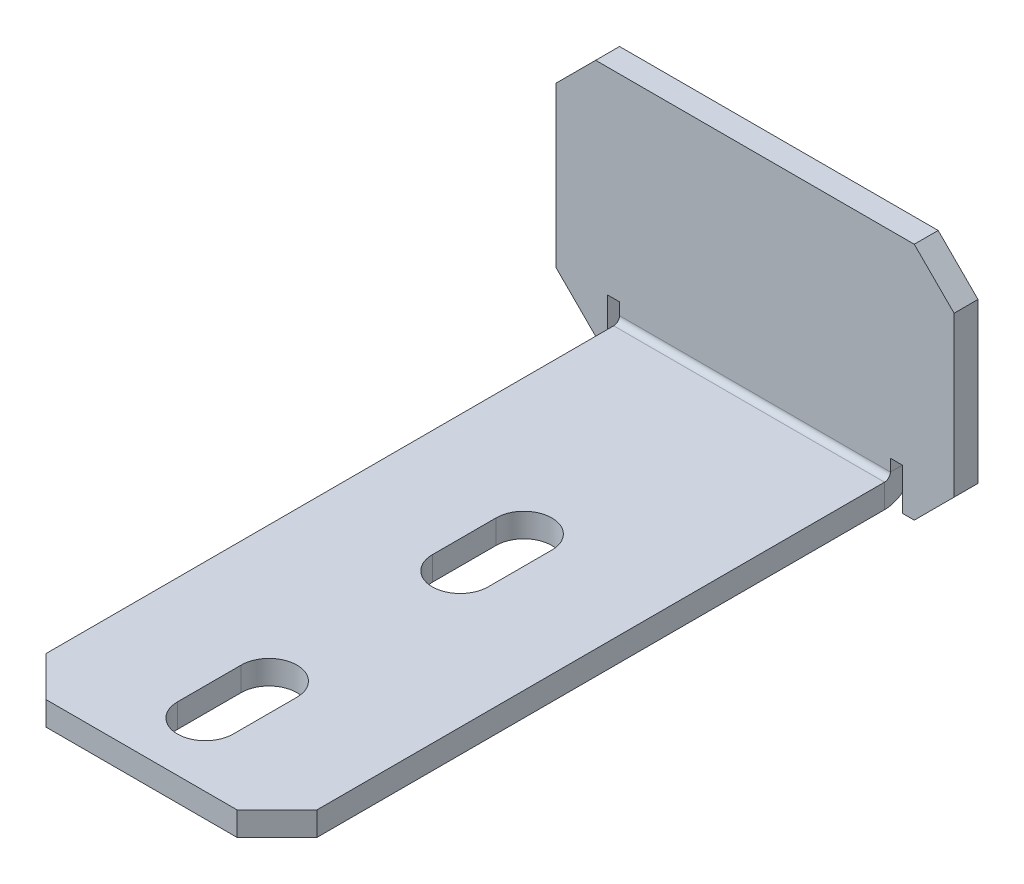
ISO-10303-21;
HEADER;
FILE_DESCRIPTION(('STEP AP214'),'2;1');
FILE_NAME('part.step','',(''),(''),'','','');
FILE_SCHEMA(('AUTOMOTIVE_DESIGN { 1 0 10303 214 1 1 1 1 }'));
ENDSEC;
DATA;
#1=APPLICATION_CONTEXT('core data for automotive mechanical design processes');
#2=APPLICATION_PROTOCOL_DEFINITION('international standard','automotive_design',2000,#1);
#3=PRODUCT_CONTEXT('',#1,'mechanical');
#4=PRODUCT('Part','Part','',(#3));
#5=PRODUCT_RELATED_PRODUCT_CATEGORY('part','',(#4));
#6=PRODUCT_DEFINITION_FORMATION('','',#4);
#7=PRODUCT_DEFINITION_CONTEXT('part definition',#1,'design');
#8=PRODUCT_DEFINITION('design','',#6,#7);
#9=PRODUCT_DEFINITION_SHAPE('','',#8);
#10=(LENGTH_UNIT() NAMED_UNIT(*) SI_UNIT(.MILLI.,.METRE.));
#11=(NAMED_UNIT(*) PLANE_ANGLE_UNIT() SI_UNIT($,.RADIAN.));
#12=(NAMED_UNIT(*) SI_UNIT($,.STERADIAN.) SOLID_ANGLE_UNIT());
#13=UNCERTAINTY_MEASURE_WITH_UNIT(LENGTH_MEASURE(1.E-05),#10,'distance_accuracy_value','');
#14=(GEOMETRIC_REPRESENTATION_CONTEXT(3) GLOBAL_UNCERTAINTY_ASSIGNED_CONTEXT((#13)) GLOBAL_UNIT_ASSIGNED_CONTEXT((#10,
#11,#12)) REPRESENTATION_CONTEXT('',''));
#15=CARTESIAN_POINT('',(0.,0.,0.));
#16=DIRECTION('',(0.,0.,1.));
#17=DIRECTION('',(1.,0.,0.));
#18=AXIS2_PLACEMENT_3D('',#15,#16,#17);
#19=CARTESIAN_POINT('',(0.,0.,-3.));
#20=DIRECTION('',(0.,-1.,0.));
#21=DIRECTION('',(0.,0.,-1.));
#22=AXIS2_PLACEMENT_3D('',#19,#20,#21);
#23=PLANE('',#22);
#24=DIRECTION('',(1.,0.,0.));
#25=VECTOR('',#24,1.);
#26=CARTESIAN_POINT('',(0.,0.,-3.));
#27=LINE('',#26,#25);
#28=CARTESIAN_POINT('',(43.5,0.,-3.));
#29=VERTEX_POINT('',#28);
#30=CARTESIAN_POINT('',(45.,0.,-3.));
#31=VERTEX_POINT('',#30);
#32=EDGE_CURVE('E431',#29,#31,#27,.T.);
#33=ORIENTED_EDGE('',*,*,#32,.T.);
#34=DIRECTION('',(0.,0.,1.));
#35=VECTOR('',#34,1.);
#36=CARTESIAN_POINT('',(45.,0.,-3.));
#37=LINE('',#36,#35);
#38=CARTESIAN_POINT('',(45.,0.,0.));
#39=VERTEX_POINT('',#38);
#40=EDGE_CURVE('E469',#31,#39,#37,.T.);
#41=ORIENTED_EDGE('',*,*,#40,.T.);
#42=DIRECTION('',(1.,0.,0.));
#43=VECTOR('',#42,1.);
#44=CARTESIAN_POINT('',(0.,0.,0.));
#45=LINE('',#44,#43);
#46=CARTESIAN_POINT('',(43.5,0.,0.));
#47=VERTEX_POINT('',#46);
#48=EDGE_CURVE('E444',#47,#39,#45,.T.);
#49=ORIENTED_EDGE('',*,*,#48,.F.);
#50=DIRECTION('',(0.,0.,-1.));
#51=VECTOR('',#50,1.);
#52=CARTESIAN_POINT('',(43.5,0.,0.));
#53=LINE('',#52,#51);
#54=EDGE_CURVE('E383',#47,#29,#53,.T.);
#55=ORIENTED_EDGE('',*,*,#54,.T.);
#56=EDGE_LOOP('',(#33,#41,#49,#55));
#57=FACE_BOUND('',#56,.T.);
#58=ADVANCED_FACE('F60',(#57),#23,.T.);
#59=CARTESIAN_POINT('',(5.,0.,0.));
#60=VERTEX_POINT('',#59);
#61=CARTESIAN_POINT('',(6.5,0.,0.));
#62=VERTEX_POINT('',#61);
#63=EDGE_CURVE('E445',#60,#62,#45,.T.);
#64=ORIENTED_EDGE('',*,*,#63,.F.);
#65=DIRECTION('',(0.,0.,-1.));
#66=VECTOR('',#65,1.);
#67=CARTESIAN_POINT('',(5.,0.,-3.));
#68=LINE('',#67,#66);
#69=CARTESIAN_POINT('',(5.,0.,-3.));
#70=VERTEX_POINT('',#69);
#71=EDGE_CURVE('E498',#60,#70,#68,.T.);
#72=ORIENTED_EDGE('',*,*,#71,.T.);
#73=CARTESIAN_POINT('',(6.5,0.,-3.));
#74=VERTEX_POINT('',#73);
#75=EDGE_CURVE('E433',#70,#74,#27,.T.);
#76=ORIENTED_EDGE('',*,*,#75,.T.);
#77=DIRECTION('',(0.,0.,-1.));
#78=VECTOR('',#77,1.);
#79=CARTESIAN_POINT('',(6.5,0.,0.));
#80=LINE('',#79,#78);
#81=EDGE_CURVE('E402',#62,#74,#80,.T.);
#82=ORIENTED_EDGE('',*,*,#81,.F.);
#83=EDGE_LOOP('',(#64,#72,#76,#82));
#84=FACE_BOUND('',#83,.T.);
#85=ADVANCED_FACE('F597',(#84),#23,.T.);
#86=CARTESIAN_POINT('',(0.,0.,-3.));
#87=DIRECTION('',(0.,0.,-1.));
#88=DIRECTION('',(-1.,0.,0.));
#89=AXIS2_PLACEMENT_3D('',#86,#87,#88);
#90=PLANE('',#89);
#91=DIRECTION('',(0.,1.,0.));
#92=VECTOR('',#91,1.);
#93=CARTESIAN_POINT('',(50.,0.,-3.));
#94=LINE('',#93,#92);
#95=CARTESIAN_POINT('',(50.,5.,-3.));
#96=VERTEX_POINT('',#95);
#97=CARTESIAN_POINT('',(50.,25.,-3.));
#98=VERTEX_POINT('',#97);
#99=EDGE_CURVE('E435',#96,#98,#94,.T.);
#100=ORIENTED_EDGE('',*,*,#99,.F.);
#101=DIRECTION('',(0.707106781186547,0.707106781186549,0.));
#102=VECTOR('',#101,1.);
#103=CARTESIAN_POINT('',(22.5000000000001,-22.5,-3.));
#104=LINE('',#103,#102);
#105=EDGE_CURVE('E491',#96,#31,#104,.F.);
#106=ORIENTED_EDGE('',*,*,#105,.T.);
#107=ORIENTED_EDGE('',*,*,#32,.F.);
#108=DIRECTION('',(0.,1.,0.));
#109=VECTOR('',#108,1.);
#110=CARTESIAN_POINT('',(43.5,0.,-3.));
#111=LINE('',#110,#109);
#112=CARTESIAN_POINT('',(43.5,5.23660000000002,-3.));
#113=VERTEX_POINT('',#112);
#114=EDGE_CURVE('E425',#29,#113,#111,.T.);
#115=ORIENTED_EDGE('',*,*,#114,.T.);
#116=DIRECTION('',(-1.,0.,0.));
#117=VECTOR('',#116,1.);
#118=CARTESIAN_POINT('',(0.,5.23660000000002,-3.));
#119=LINE('',#118,#117);
#120=CARTESIAN_POINT('',(42.,5.23660000000002,-3.));
#121=VERTEX_POINT('',#120);
#122=EDGE_CURVE('E423',#113,#121,#119,.T.);
#123=ORIENTED_EDGE('',*,*,#122,.T.);
#124=DIRECTION('',(0.,-1.,0.));
#125=VECTOR('',#124,1.);
#126=CARTESIAN_POINT('',(42.,0.,-3.));
#127=LINE('',#126,#125);
#128=CARTESIAN_POINT('',(42.,3.7366,-3.));
#129=VERTEX_POINT('',#128);
#130=EDGE_CURVE('E420',#121,#129,#127,.T.);
#131=ORIENTED_EDGE('',*,*,#130,.T.);
#132=DIRECTION('',(1.,0.,0.));
#133=VECTOR('',#132,1.);
#134=CARTESIAN_POINT('',(42.,3.7366,-3.));
#135=LINE('',#134,#133);
#136=CARTESIAN_POINT('',(8.,3.7366,-3.));
#137=VERTEX_POINT('',#136);
#138=EDGE_CURVE('E356',#129,#137,#135,.F.);
#139=ORIENTED_EDGE('',*,*,#138,.T.);
#140=DIRECTION('',(0.,1.,0.));
#141=VECTOR('',#140,1.);
#142=CARTESIAN_POINT('',(8.,0.,-3.));
#143=LINE('',#142,#141);
#144=CARTESIAN_POINT('',(8.,5.23660000000002,-3.));
#145=VERTEX_POINT('',#144);
#146=EDGE_CURVE('E418',#137,#145,#143,.T.);
#147=ORIENTED_EDGE('',*,*,#146,.T.);
#148=DIRECTION('',(-1.,0.,0.));
#149=VECTOR('',#148,1.);
#150=CARTESIAN_POINT('',(0.,5.23660000000002,-3.));
#151=LINE('',#150,#149);
#152=CARTESIAN_POINT('',(6.5,5.23660000000002,-3.));
#153=VERTEX_POINT('',#152);
#154=EDGE_CURVE('E416',#145,#153,#151,.T.);
#155=ORIENTED_EDGE('',*,*,#154,.T.);
#156=DIRECTION('',(0.,-1.,0.));
#157=VECTOR('',#156,1.);
#158=CARTESIAN_POINT('',(6.5,0.,-3.));
#159=LINE('',#158,#157);
#160=EDGE_CURVE('E382',#153,#74,#159,.T.);
#161=ORIENTED_EDGE('',*,*,#160,.T.);
#162=ORIENTED_EDGE('',*,*,#75,.F.);
#163=DIRECTION('',(0.707106781186549,-0.707106781186547,0.));
#164=VECTOR('',#163,1.);
#165=CARTESIAN_POINT('',(2.5,2.5,-3.));
#166=LINE('',#165,#164);
#167=CARTESIAN_POINT('',(0.,4.99999999999999,-3.));
#168=VERTEX_POINT('',#167);
#169=EDGE_CURVE('E489',#70,#168,#166,.F.);
#170=ORIENTED_EDGE('',*,*,#169,.T.);
#171=DIRECTION('',(0.,-1.,0.));
#172=VECTOR('',#171,1.);
#173=CARTESIAN_POINT('',(0.,0.,-3.));
#174=LINE('',#173,#172);
#175=CARTESIAN_POINT('',(0.,25.,-3.));
#176=VERTEX_POINT('',#175);
#177=EDGE_CURVE('E428',#176,#168,#174,.T.);
#178=ORIENTED_EDGE('',*,*,#177,.F.);
#179=DIRECTION('',(-0.707106781186547,-0.707106781186549,0.));
#180=VECTOR('',#179,1.);
#181=CARTESIAN_POINT('',(-12.5,12.5,-3.));
#182=LINE('',#181,#180);
#183=CARTESIAN_POINT('',(4.99999999999999,30.,-3.));
#184=VERTEX_POINT('',#183);
#185=EDGE_CURVE('E487',#176,#184,#182,.F.);
#186=ORIENTED_EDGE('',*,*,#185,.T.);
#187=DIRECTION('',(-1.,0.,0.));
#188=VECTOR('',#187,1.);
#189=CARTESIAN_POINT('',(0.,30.,-3.));
#190=LINE('',#189,#188);
#191=CARTESIAN_POINT('',(45.,30.,-3.));
#192=VERTEX_POINT('',#191);
#193=EDGE_CURVE('E438',#192,#184,#190,.T.);
#194=ORIENTED_EDGE('',*,*,#193,.F.);
#195=DIRECTION('',(-0.707106781186548,0.707106781186547,0.));
#196=VECTOR('',#195,1.);
#197=CARTESIAN_POINT('',(37.4999999999999,37.5,-3.));
#198=LINE('',#197,#196);
#199=EDGE_CURVE('E485',#192,#98,#198,.F.);
#200=ORIENTED_EDGE('',*,*,#199,.T.);
#201=EDGE_LOOP('',(#100,#106,#107,#115,#123,#131,#139,#147,#155,#161,#162,#170,#178,#186,#194,#200));
#202=FACE_BOUND('',#201,.T.);
#203=ADVANCED_FACE('F509',(#202),#90,.T.);
#204=CARTESIAN_POINT('',(0.,0.,0.));
#205=DIRECTION('',(0.,0.,-1.));
#206=DIRECTION('',(-1.,0.,0.));
#207=AXIS2_PLACEMENT_3D('',#204,#205,#206);
#208=PLANE('',#207);
#209=ORIENTED_EDGE('',*,*,#48,.T.);
#210=DIRECTION('',(-0.707106781186547,-0.707106781186549,0.));
#211=VECTOR('',#210,1.);
#212=CARTESIAN_POINT('',(45.,0.,0.));
#213=LINE('',#212,#211);
#214=CARTESIAN_POINT('',(50.,5.,0.));
#215=VERTEX_POINT('',#214);
#216=EDGE_CURVE('E478',#39,#215,#213,.F.);
#217=ORIENTED_EDGE('',*,*,#216,.T.);
#218=DIRECTION('',(0.,1.,0.));
#219=VECTOR('',#218,1.);
#220=CARTESIAN_POINT('',(50.,0.,0.));
#221=LINE('',#220,#219);
#222=CARTESIAN_POINT('',(50.,25.,0.));
#223=VERTEX_POINT('',#222);
#224=EDGE_CURVE('E447',#215,#223,#221,.T.);
#225=ORIENTED_EDGE('',*,*,#224,.T.);
#226=DIRECTION('',(0.707106781186548,-0.707106781186547,0.));
#227=VECTOR('',#226,1.);
#228=CARTESIAN_POINT('',(50.,25.,0.));
#229=LINE('',#228,#227);
#230=CARTESIAN_POINT('',(45.,30.,0.));
#231=VERTEX_POINT('',#230);
#232=EDGE_CURVE('E472',#223,#231,#229,.F.);
#233=ORIENTED_EDGE('',*,*,#232,.T.);
#234=DIRECTION('',(-1.,0.,0.));
#235=VECTOR('',#234,1.);
#236=CARTESIAN_POINT('',(0.,30.,0.));
#237=LINE('',#236,#235);
#238=CARTESIAN_POINT('',(4.99999999999999,30.,0.));
#239=VERTEX_POINT('',#238);
#240=EDGE_CURVE('E432',#231,#239,#237,.T.);
#241=ORIENTED_EDGE('',*,*,#240,.T.);
#242=DIRECTION('',(0.707106781186547,0.707106781186549,0.));
#243=VECTOR('',#242,1.);
#244=CARTESIAN_POINT('',(4.99999999999999,30.,0.));
#245=LINE('',#244,#243);
#246=CARTESIAN_POINT('',(0.,25.,0.));
#247=VERTEX_POINT('',#246);
#248=EDGE_CURVE('E474',#239,#247,#245,.F.);
#249=ORIENTED_EDGE('',*,*,#248,.T.);
#250=DIRECTION('',(0.,-1.,0.));
#251=VECTOR('',#250,1.);
#252=CARTESIAN_POINT('',(0.,0.,0.));
#253=LINE('',#252,#251);
#254=CARTESIAN_POINT('',(0.,4.99999999999999,0.));
#255=VERTEX_POINT('',#254);
#256=EDGE_CURVE('E427',#247,#255,#253,.T.);
#257=ORIENTED_EDGE('',*,*,#256,.T.);
#258=DIRECTION('',(-0.707106781186549,0.707106781186547,0.));
#259=VECTOR('',#258,1.);
#260=CARTESIAN_POINT('',(0.,4.99999999999999,0.));
#261=LINE('',#260,#259);
#262=EDGE_CURVE('E476',#255,#60,#261,.F.);
#263=ORIENTED_EDGE('',*,*,#262,.T.);
#264=ORIENTED_EDGE('',*,*,#63,.T.);
#265=DIRECTION('',(0.,-1.,0.));
#266=VECTOR('',#265,1.);
#267=CARTESIAN_POINT('',(6.5,5.2366,0.));
#268=LINE('',#267,#266);
#269=CARTESIAN_POINT('',(6.5,5.23660000000002,0.));
#270=VERTEX_POINT('',#269);
#271=EDGE_CURVE('E399',#270,#62,#268,.T.);
#272=ORIENTED_EDGE('',*,*,#271,.F.);
#273=DIRECTION('',(-1.,0.,0.));
#274=VECTOR('',#273,1.);
#275=CARTESIAN_POINT('',(8.,5.2366,0.));
#276=LINE('',#275,#274);
#277=CARTESIAN_POINT('',(8.,5.2366,0.));
#278=VERTEX_POINT('',#277);
#279=EDGE_CURVE('E395',#278,#270,#276,.T.);
#280=ORIENTED_EDGE('',*,*,#279,.F.);
#281=DIRECTION('',(0.,1.,0.));
#282=VECTOR('',#281,1.);
#283=CARTESIAN_POINT('',(8.,3.7366,0.));
#284=LINE('',#283,#282);
#285=CARTESIAN_POINT('',(8.,3.7366,0.));
#286=VERTEX_POINT('',#285);
#287=EDGE_CURVE('E392',#286,#278,#284,.T.);
#288=ORIENTED_EDGE('',*,*,#287,.F.);
#289=DIRECTION('',(1.,0.,0.));
#290=VECTOR('',#289,1.);
#291=CARTESIAN_POINT('',(42.,3.7366,0.));
#292=LINE('',#291,#290);
#293=CARTESIAN_POINT('',(42.,3.7366,0.));
#294=VERTEX_POINT('',#293);
#295=EDGE_CURVE('E369',#294,#286,#292,.F.);
#296=ORIENTED_EDGE('',*,*,#295,.F.);
#297=DIRECTION('',(0.,-1.,0.));
#298=VECTOR('',#297,1.);
#299=CARTESIAN_POINT('',(42.,5.2366,0.));
#300=LINE('',#299,#298);
#301=CARTESIAN_POINT('',(42.,5.23660000000002,0.));
#302=VERTEX_POINT('',#301);
#303=EDGE_CURVE('E388',#302,#294,#300,.T.);
#304=ORIENTED_EDGE('',*,*,#303,.F.);
#305=DIRECTION('',(-1.,0.,0.));
#306=VECTOR('',#305,1.);
#307=CARTESIAN_POINT('',(43.5,5.2366,0.));
#308=LINE('',#307,#306);
#309=CARTESIAN_POINT('',(43.5,5.2366,0.));
#310=VERTEX_POINT('',#309);
#311=EDGE_CURVE('E384',#310,#302,#308,.T.);
#312=ORIENTED_EDGE('',*,*,#311,.F.);
#313=DIRECTION('',(0.,1.,0.));
#314=VECTOR('',#313,1.);
#315=CARTESIAN_POINT('',(43.5,0.,0.));
#316=LINE('',#315,#314);
#317=EDGE_CURVE('E379',#47,#310,#316,.T.);
#318=ORIENTED_EDGE('',*,*,#317,.F.);
#319=EDGE_LOOP('',(#209,#217,#225,#233,#241,#249,#257,#263,#264,#272,#280,#288,#296,#304,#312,#318));
#320=FACE_BOUND('',#319,.T.);
#321=ADVANCED_FACE('F519',(#320),#208,.F.);
#322=CARTESIAN_POINT('',(0.,0.,-3.));
#323=DIRECTION('',(-1.,0.,0.));
#324=DIRECTION('',(0.,0.,1.));
#325=AXIS2_PLACEMENT_3D('',#322,#323,#324);
#326=PLANE('',#325);
#327=ORIENTED_EDGE('',*,*,#177,.T.);
#328=DIRECTION('',(0.,0.,1.));
#329=VECTOR('',#328,1.);
#330=CARTESIAN_POINT('',(0.,4.99999999999999,-3.));
#331=LINE('',#330,#329);
#332=EDGE_CURVE('E495',#168,#255,#331,.T.);
#333=ORIENTED_EDGE('',*,*,#332,.T.);
#334=ORIENTED_EDGE('',*,*,#256,.F.);
#335=DIRECTION('',(0.,0.,-1.));
#336=VECTOR('',#335,1.);
#337=CARTESIAN_POINT('',(0.,25.,-3.));
#338=LINE('',#337,#336);
#339=EDGE_CURVE('E493',#247,#176,#338,.T.);
#340=ORIENTED_EDGE('',*,*,#339,.T.);
#341=EDGE_LOOP('',(#327,#333,#334,#340));
#342=FACE_BOUND('',#341,.T.);
#343=ADVANCED_FACE('F606',(#342),#326,.T.);
#344=CARTESIAN_POINT('',(0.,30.,-3.));
#345=DIRECTION('',(0.,1.,0.));
#346=DIRECTION('',(0.,0.,1.));
#347=AXIS2_PLACEMENT_3D('',#344,#345,#346);
#348=PLANE('',#347);
#349=ORIENTED_EDGE('',*,*,#193,.T.);
#350=DIRECTION('',(0.,0.,1.));
#351=VECTOR('',#350,1.);
#352=CARTESIAN_POINT('',(4.99999999999999,30.,-3.));
#353=LINE('',#352,#351);
#354=EDGE_CURVE('E13',#184,#239,#353,.T.);
#355=ORIENTED_EDGE('',*,*,#354,.T.);
#356=ORIENTED_EDGE('',*,*,#240,.F.);
#357=DIRECTION('',(0.,0.,-1.));
#358=VECTOR('',#357,1.);
#359=CARTESIAN_POINT('',(45.,30.,-3.));
#360=LINE('',#359,#358);
#361=EDGE_CURVE('E69',#231,#192,#360,.T.);
#362=ORIENTED_EDGE('',*,*,#361,.T.);
#363=EDGE_LOOP('',(#349,#355,#356,#362));
#364=FACE_BOUND('',#363,.T.);
#365=ADVANCED_FACE('F503',(#364),#348,.T.);
#366=CARTESIAN_POINT('',(50.,0.,-3.));
#367=DIRECTION('',(1.,0.,0.));
#368=DIRECTION('',(0.,0.,-1.));
#369=AXIS2_PLACEMENT_3D('',#366,#367,#368);
#370=PLANE('',#369);
#371=ORIENTED_EDGE('',*,*,#224,.F.);
#372=DIRECTION('',(0.,0.,-1.));
#373=VECTOR('',#372,1.);
#374=CARTESIAN_POINT('',(50.,5.,-3.));
#375=LINE('',#374,#373);
#376=EDGE_CURVE('E483',#215,#96,#375,.T.);
#377=ORIENTED_EDGE('',*,*,#376,.T.);
#378=ORIENTED_EDGE('',*,*,#99,.T.);
#379=DIRECTION('',(0.,0.,1.));
#380=VECTOR('',#379,1.);
#381=CARTESIAN_POINT('',(50.,25.,-3.));
#382=LINE('',#381,#380);
#383=EDGE_CURVE('E480',#98,#223,#382,.T.);
#384=ORIENTED_EDGE('',*,*,#383,.T.);
#385=EDGE_LOOP('',(#371,#377,#378,#384));
#386=FACE_BOUND('',#385,.T.);
#387=ADVANCED_FACE('F515',(#386),#370,.T.);
#388=CARTESIAN_POINT('',(43.5,0.,0.));
#389=DIRECTION('',(-1.,0.,0.));
#390=DIRECTION('',(0.,0.,1.));
#391=AXIS2_PLACEMENT_3D('',#388,#389,#390);
#392=PLANE('',#391);
#393=ORIENTED_EDGE('',*,*,#114,.F.);
#394=ORIENTED_EDGE('',*,*,#54,.F.);
#395=ORIENTED_EDGE('',*,*,#317,.T.);
#396=DIRECTION('',(0.,0.,-1.));
#397=VECTOR('',#396,1.);
#398=CARTESIAN_POINT('',(43.5,5.2366,0.));
#399=LINE('',#398,#397);
#400=EDGE_CURVE('E387',#310,#113,#399,.T.);
#401=ORIENTED_EDGE('',*,*,#400,.T.);
#402=EDGE_LOOP('',(#393,#394,#395,#401));
#403=FACE_BOUND('',#402,.T.);
#404=ADVANCED_FACE('F532',(#403),#392,.T.);
#405=CARTESIAN_POINT('',(43.5,5.2366,0.));
#406=DIRECTION('',(0.,-1.,0.));
#407=DIRECTION('',(0.,0.,-1.));
#408=AXIS2_PLACEMENT_3D('',#405,#406,#407);
#409=PLANE('',#408);
#410=ORIENTED_EDGE('',*,*,#122,.F.);
#411=ORIENTED_EDGE('',*,*,#400,.F.);
#412=ORIENTED_EDGE('',*,*,#311,.T.);
#413=DIRECTION('',(0.,0.,-1.));
#414=VECTOR('',#413,1.);
#415=CARTESIAN_POINT('',(42.,5.2366,0.));
#416=LINE('',#415,#414);
#417=EDGE_CURVE('E391',#302,#121,#416,.T.);
#418=ORIENTED_EDGE('',*,*,#417,.T.);
#419=EDGE_LOOP('',(#410,#411,#412,#418));
#420=FACE_BOUND('',#419,.T.);
#421=ADVANCED_FACE('F535',(#420),#409,.T.);
#422=CARTESIAN_POINT('',(42.,5.2366,0.));
#423=DIRECTION('',(1.,0.,0.));
#424=DIRECTION('',(0.,0.,-1.));
#425=AXIS2_PLACEMENT_3D('',#422,#423,#424);
#426=PLANE('',#425);
#427=ORIENTED_EDGE('',*,*,#130,.F.);
#428=ORIENTED_EDGE('',*,*,#417,.F.);
#429=ORIENTED_EDGE('',*,*,#303,.T.);
#430=DIRECTION('',(0.,0.,-1.));
#431=VECTOR('',#430,1.);
#432=CARTESIAN_POINT('',(42.,3.7366,0.));
#433=LINE('',#432,#431);
#434=EDGE_CURVE('E363',#294,#129,#433,.T.);
#435=ORIENTED_EDGE('',*,*,#434,.T.);
#436=EDGE_LOOP('',(#427,#428,#429,#435));
#437=FACE_BOUND('',#436,.T.);
#438=ADVANCED_FACE('F539',(#437),#426,.T.);
#439=CARTESIAN_POINT('',(8.,3.7366,0.));
#440=DIRECTION('',(-1.,0.,0.));
#441=DIRECTION('',(0.,0.,1.));
#442=AXIS2_PLACEMENT_3D('',#439,#440,#441);
#443=PLANE('',#442);
#444=ORIENTED_EDGE('',*,*,#146,.F.);
#445=DIRECTION('',(0.,0.,-1.));
#446=VECTOR('',#445,1.);
#447=CARTESIAN_POINT('',(8.,3.7366,0.));
#448=LINE('',#447,#446);
#449=EDGE_CURVE('E373',#286,#137,#448,.T.);
#450=ORIENTED_EDGE('',*,*,#449,.F.);
#451=ORIENTED_EDGE('',*,*,#287,.T.);
#452=DIRECTION('',(0.,0.,-1.));
#453=VECTOR('',#452,1.);
#454=CARTESIAN_POINT('',(8.,5.2366,0.));
#455=LINE('',#454,#453);
#456=EDGE_CURVE('E398',#278,#145,#455,.T.);
#457=ORIENTED_EDGE('',*,*,#456,.T.);
#458=EDGE_LOOP('',(#444,#450,#451,#457));
#459=FACE_BOUND('',#458,.T.);
#460=ADVANCED_FACE('F554',(#459),#443,.T.);
#461=CARTESIAN_POINT('',(8.,5.2366,0.));
#462=DIRECTION('',(0.,-1.,0.));
#463=DIRECTION('',(0.,0.,-1.));
#464=AXIS2_PLACEMENT_3D('',#461,#462,#463);
#465=PLANE('',#464);
#466=ORIENTED_EDGE('',*,*,#154,.F.);
#467=ORIENTED_EDGE('',*,*,#456,.F.);
#468=ORIENTED_EDGE('',*,*,#279,.T.);
#469=DIRECTION('',(0.,0.,-1.));
#470=VECTOR('',#469,1.);
#471=CARTESIAN_POINT('',(6.5,5.2366,0.));
#472=LINE('',#471,#470);
#473=EDGE_CURVE('E376',#270,#153,#472,.T.);
#474=ORIENTED_EDGE('',*,*,#473,.T.);
#475=EDGE_LOOP('',(#466,#467,#468,#474));
#476=FACE_BOUND('',#475,.T.);
#477=ADVANCED_FACE('F654',(#476),#465,.T.);
#478=CARTESIAN_POINT('',(6.5,5.2366,0.));
#479=DIRECTION('',(1.,0.,0.));
#480=DIRECTION('',(0.,0.,-1.));
#481=AXIS2_PLACEMENT_3D('',#478,#479,#480);
#482=PLANE('',#481);
#483=ORIENTED_EDGE('',*,*,#160,.F.);
#484=ORIENTED_EDGE('',*,*,#473,.F.);
#485=ORIENTED_EDGE('',*,*,#271,.T.);
#486=ORIENTED_EDGE('',*,*,#81,.T.);
#487=EDGE_LOOP('',(#483,#484,#485,#486));
#488=FACE_BOUND('',#487,.T.);
#489=ADVANCED_FACE('F652',(#488),#482,.T.);
#490=CARTESIAN_POINT('',(8.,3.7366,0.7366));
#491=DIRECTION('',(-1.,0.,0.));
#492=DIRECTION('',(0.,0.,1.));
#493=AXIS2_PLACEMENT_3D('',#490,#491,#492);
#494=PLANE('',#493);
#495=DIRECTION('',(0.,1.,0.));
#496=VECTOR('',#495,1.);
#497=CARTESIAN_POINT('',(8.,0.,0.736599999999987));
#498=LINE('',#497,#496);
#499=CARTESIAN_POINT('',(8.,3.,0.736599999999997));
#500=VERTEX_POINT('',#499);
#501=CARTESIAN_POINT('',(8.,0.,0.736599999999986));
#502=VERTEX_POINT('',#501);
#503=EDGE_CURVE('E328',#500,#502,#498,.F.);
#504=ORIENTED_EDGE('',*,*,#503,.F.);
#505=CARTESIAN_POINT('',(8.,3.7366,0.7366));
#506=DIRECTION('',(1.,0.,0.));
#507=DIRECTION('',(0.,0.,-1.));
#508=AXIS2_PLACEMENT_3D('',#505,#506,#507);
#509=CIRCLE('',#508,0.7366);
#510=EDGE_CURVE('E366',#286,#500,#509,.F.);
#511=ORIENTED_EDGE('',*,*,#510,.F.);
#512=ORIENTED_EDGE('',*,*,#449,.T.);
#513=CARTESIAN_POINT('',(8.,3.7366,0.7366));
#514=DIRECTION('',(1.,0.,0.));
#515=DIRECTION('',(0.,0.,-1.));
#516=AXIS2_PLACEMENT_3D('',#513,#514,#515);
#517=CIRCLE('',#516,3.7366);
#518=EDGE_CURVE('E359',#137,#502,#517,.F.);
#519=ORIENTED_EDGE('',*,*,#518,.T.);
#520=EDGE_LOOP('',(#504,#511,#512,#519));
#521=FACE_BOUND('',#520,.T.);
#522=ADVANCED_FACE('F557',(#521),#494,.T.);
#523=CARTESIAN_POINT('',(42.,3.7366,0.7366));
#524=DIRECTION('',(-1.,0.,0.));
#525=DIRECTION('',(0.,0.,1.));
#526=AXIS2_PLACEMENT_3D('',#523,#524,#525);
#527=PLANE('',#526);
#528=CARTESIAN_POINT('',(42.,3.7366,0.7366));
#529=DIRECTION('',(1.,0.,0.));
#530=DIRECTION('',(0.,0.,-1.));
#531=AXIS2_PLACEMENT_3D('',#528,#529,#530);
#532=CIRCLE('',#531,0.7366);
#533=CARTESIAN_POINT('',(42.,3.,0.736599999999997));
#534=VERTEX_POINT('',#533);
#535=EDGE_CURVE('E332',#534,#294,#532,.T.);
#536=ORIENTED_EDGE('',*,*,#535,.F.);
#537=DIRECTION('',(0.,1.,0.));
#538=VECTOR('',#537,1.);
#539=CARTESIAN_POINT('',(42.,3.,0.736599999999997));
#540=LINE('',#539,#538);
#541=CARTESIAN_POINT('',(42.,0.,0.736599999999986));
#542=VERTEX_POINT('',#541);
#543=EDGE_CURVE('E349',#534,#542,#540,.F.);
#544=ORIENTED_EDGE('',*,*,#543,.T.);
#545=CARTESIAN_POINT('',(42.,3.7366,0.7366));
#546=DIRECTION('',(1.,0.,0.));
#547=DIRECTION('',(0.,0.,-1.));
#548=AXIS2_PLACEMENT_3D('',#545,#546,#547);
#549=CIRCLE('',#548,3.7366);
#550=EDGE_CURVE('E360',#542,#129,#549,.T.);
#551=ORIENTED_EDGE('',*,*,#550,.T.);
#552=ORIENTED_EDGE('',*,*,#434,.F.);
#553=EDGE_LOOP('',(#536,#544,#551,#552));
#554=FACE_BOUND('',#553,.T.);
#555=ADVANCED_FACE('F542',(#554),#527,.F.);
#556=CARTESIAN_POINT('',(42.,3.7366,0.7366));
#557=DIRECTION('',(1.,0.,0.));
#558=DIRECTION('',(0.,-1.,0.));
#559=AXIS2_PLACEMENT_3D('',#556,#557,#558);
#560=CYLINDRICAL_SURFACE('',#559,3.7366);
#561=ORIENTED_EDGE('',*,*,#138,.F.);
#562=ORIENTED_EDGE('',*,*,#550,.F.);
#563=DIRECTION('',(1.,0.,0.));
#564=VECTOR('',#563,1.);
#565=CARTESIAN_POINT('',(8.,0.,0.736599999999987));
#566=LINE('',#565,#564);
#567=EDGE_CURVE('E346',#542,#502,#566,.F.);
#568=ORIENTED_EDGE('',*,*,#567,.T.);
#569=ORIENTED_EDGE('',*,*,#518,.F.);
#570=EDGE_LOOP('',(#561,#562,#568,#569));
#571=FACE_BOUND('',#570,.T.);
#572=ADVANCED_FACE('F560',(#571),#560,.T.);
#573=CARTESIAN_POINT('',(42.,3.7366,0.7366));
#574=DIRECTION('',(1.,0.,0.));
#575=DIRECTION('',(0.,-1.,0.));
#576=AXIS2_PLACEMENT_3D('',#573,#574,#575);
#577=CYLINDRICAL_SURFACE('',#576,0.7366);
#578=ORIENTED_EDGE('',*,*,#295,.T.);
#579=ORIENTED_EDGE('',*,*,#510,.T.);
#580=DIRECTION('',(1.,0.,0.));
#581=VECTOR('',#580,1.);
#582=CARTESIAN_POINT('',(8.,3.,0.736599999999997));
#583=LINE('',#582,#581);
#584=EDGE_CURVE('E352',#500,#534,#583,.T.);
#585=ORIENTED_EDGE('',*,*,#584,.T.);
#586=ORIENTED_EDGE('',*,*,#535,.T.);
#587=EDGE_LOOP('',(#578,#579,#585,#586));
#588=FACE_BOUND('',#587,.T.);
#589=ADVANCED_FACE('F546',(#588),#577,.F.);
#590=CARTESIAN_POINT('',(8.,0.,0.));
#591=DIRECTION('',(1.,0.,0.));
#592=DIRECTION('',(0.,0.,-1.));
#593=AXIS2_PLACEMENT_3D('',#590,#591,#592);
#594=PLANE('',#593);
#595=DIRECTION('',(0.,0.,-1.));
#596=VECTOR('',#595,1.);
#597=CARTESIAN_POINT('',(8.,0.,0.));
#598=LINE('',#597,#596);
#599=CARTESIAN_POINT('',(8.,-2.51386656396706E-13,72.));
#600=VERTEX_POINT('',#599);
#601=EDGE_CURVE('E336',#600,#502,#598,.T.);
#602=ORIENTED_EDGE('',*,*,#601,.F.);
#603=DIRECTION('',(0.,1.,0.));
#604=VECTOR('',#603,1.);
#605=CARTESIAN_POINT('',(8.,-2.51386656396706E-13,72.));
#606=LINE('',#605,#604);
#607=CARTESIAN_POINT('',(8.,2.99999999999975,72.));
#608=VERTEX_POINT('',#607);
#609=EDGE_CURVE('E441',#600,#608,#606,.T.);
#610=ORIENTED_EDGE('',*,*,#609,.T.);
#611=DIRECTION('',(0.,0.,1.));
#612=VECTOR('',#611,1.);
#613=CARTESIAN_POINT('',(8.,3.,0.));
#614=LINE('',#613,#612);
#615=EDGE_CURVE('E344',#608,#500,#614,.F.);
#616=ORIENTED_EDGE('',*,*,#615,.T.);
#617=ORIENTED_EDGE('',*,*,#503,.T.);
#618=EDGE_LOOP('',(#602,#610,#616,#617));
#619=FACE_BOUND('',#618,.T.);
#620=ADVANCED_FACE('F584',(#619),#594,.F.);
#621=CARTESIAN_POINT('',(42.,-2.68882138776405E-13,77.));
#622=DIRECTION('',(-1.,0.,0.));
#623=DIRECTION('',(0.,0.,1.));
#624=AXIS2_PLACEMENT_3D('',#621,#622,#623);
#625=PLANE('',#624);
#626=DIRECTION('',(0.,0.,-1.));
#627=VECTOR('',#626,1.);
#628=CARTESIAN_POINT('',(42.,2.99999999999973,77.));
#629=LINE('',#628,#627);
#630=CARTESIAN_POINT('',(42.,2.99999999999975,72.));
#631=VERTEX_POINT('',#630);
#632=EDGE_CURVE('E341',#534,#631,#629,.F.);
#633=ORIENTED_EDGE('',*,*,#632,.T.);
#634=DIRECTION('',(0.,-1.,0.));
#635=VECTOR('',#634,1.);
#636=CARTESIAN_POINT('',(42.,-2.51424732082189E-13,72.));
#637=LINE('',#636,#635);
#638=CARTESIAN_POINT('',(42.,-2.51386656396706E-13,72.));
#639=VERTEX_POINT('',#638);
#640=EDGE_CURVE('E467',#631,#639,#637,.T.);
#641=ORIENTED_EDGE('',*,*,#640,.T.);
#642=DIRECTION('',(0.,0.,1.));
#643=VECTOR('',#642,1.);
#644=CARTESIAN_POINT('',(42.,0.,0.));
#645=LINE('',#644,#643);
#646=EDGE_CURVE('E333',#542,#639,#645,.T.);
#647=ORIENTED_EDGE('',*,*,#646,.F.);
#648=ORIENTED_EDGE('',*,*,#543,.F.);
#649=EDGE_LOOP('',(#633,#641,#647,#648));
#650=FACE_BOUND('',#649,.T.);
#651=ADVANCED_FACE('F568',(#650),#625,.F.);
#652=CARTESIAN_POINT('',(0.,0.,0.));
#653=DIRECTION('',(0.,1.,0.));
#654=DIRECTION('',(0.,0.,1.));
#655=AXIS2_PLACEMENT_3D('',#652,#653,#654);
#656=PLANE('',#655);
#657=DIRECTION('',(0.,0.,-1.));
#658=VECTOR('',#657,1.);
#659=CARTESIAN_POINT('',(28.5,0.,0.));
#660=LINE('',#659,#658);
#661=CARTESIAN_POINT('',(28.5,-1.4137996329211E-13,37.));
#662=VERTEX_POINT('',#661);
#663=CARTESIAN_POINT('',(28.5,-1.15359111152458E-13,29.));
#664=VERTEX_POINT('',#663);
#665=EDGE_CURVE('E322',#662,#664,#660,.T.);
#666=ORIENTED_EDGE('',*,*,#665,.T.);
#667=CARTESIAN_POINT('',(25.,-1.01481323344643E-13,29.));
#668=DIRECTION('',(0.,1.,0.));
#669=DIRECTION('',(0.,0.,1.));
#670=AXIS2_PLACEMENT_3D('',#667,#668,#669);
#671=CIRCLE('',#670,3.5);
#672=CARTESIAN_POINT('',(21.5,-1.15359111152458E-13,29.));
#673=VERTEX_POINT('',#672);
#674=EDGE_CURVE('E325',#664,#673,#671,.T.);
#675=ORIENTED_EDGE('',*,*,#674,.T.);
#676=DIRECTION('',(0.,0.,1.));
#677=VECTOR('',#676,1.);
#678=CARTESIAN_POINT('',(21.5,0.,0.));
#679=LINE('',#678,#677);
#680=CARTESIAN_POINT('',(21.5,-1.29184809537196E-13,37.));
#681=VERTEX_POINT('',#680);
#682=EDGE_CURVE('E319',#673,#681,#679,.T.);
#683=ORIENTED_EDGE('',*,*,#682,.T.);
#684=CARTESIAN_POINT('',(25.,-1.29236898960272E-13,37.));
#685=DIRECTION('',(0.,1.,0.));
#686=DIRECTION('',(0.,0.,1.));
#687=AXIS2_PLACEMENT_3D('',#684,#685,#686);
#688=CIRCLE('',#687,3.5);
#689=EDGE_CURVE('E263',#681,#662,#688,.T.);
#690=ORIENTED_EDGE('',*,*,#689,.T.);
#691=EDGE_LOOP('',(#666,#675,#683,#690));
#692=FACE_BOUND('',#691,.T.);
#693=DIRECTION('',(0.,0.,1.));
#694=VECTOR('',#693,1.);
#695=CARTESIAN_POINT('',(21.5,0.,0.));
#696=LINE('',#695,#694);
#697=CARTESIAN_POINT('',(21.5,-2.25514051876985E-13,61.));
#698=VERTEX_POINT('',#697);
#699=CARTESIAN_POINT('',(21.5,-2.27248775352962E-13,69.));
#700=VERTEX_POINT('',#699);
#701=EDGE_CURVE('E313',#698,#700,#696,.T.);
#702=ORIENTED_EDGE('',*,*,#701,.T.);
#703=CARTESIAN_POINT('',(25.,-2.41126563160776E-13,69.));
#704=DIRECTION('',(0.,1.,0.));
#705=DIRECTION('',(0.,0.,1.));
#706=AXIS2_PLACEMENT_3D('',#703,#704,#705);
#707=CIRCLE('',#706,3.5);
#708=CARTESIAN_POINT('',(28.5,-2.27248775352962E-13,69.));
#709=VERTEX_POINT('',#708);
#710=EDGE_CURVE('E316',#700,#709,#707,.T.);
#711=ORIENTED_EDGE('',*,*,#710,.T.);
#712=DIRECTION('',(0.,0.,-1.));
#713=VECTOR('',#712,1.);
#714=CARTESIAN_POINT('',(28.5,0.,0.));
#715=LINE('',#714,#713);
#716=CARTESIAN_POINT('',(28.5,-2.12980361669431E-13,61.));
#717=VERTEX_POINT('',#716);
#718=EDGE_CURVE('E287',#709,#717,#715,.T.);
#719=ORIENTED_EDGE('',*,*,#718,.T.);
#720=CARTESIAN_POINT('',(25.,-2.13370987545147E-13,61.));
#721=DIRECTION('',(0.,1.,0.));
#722=DIRECTION('',(0.,0.,1.));
#723=AXIS2_PLACEMENT_3D('',#720,#721,#722);
#724=CIRCLE('',#723,3.5);
#725=EDGE_CURVE('E310',#717,#698,#724,.T.);
#726=ORIENTED_EDGE('',*,*,#725,.T.);
#727=EDGE_LOOP('',(#702,#711,#719,#726));
#728=FACE_BOUND('',#727,.T.);
#729=DIRECTION('',(-1.,0.,0.));
#730=VECTOR('',#729,1.);
#731=CARTESIAN_POINT('',(0.,-2.68844063090921E-13,77.));
#732=LINE('',#731,#730);
#733=CARTESIAN_POINT('',(37.,-2.68844063090921E-13,77.));
#734=VERTEX_POINT('',#733);
#735=CARTESIAN_POINT('',(13.,-2.68844063090921E-13,77.));
#736=VERTEX_POINT('',#735);
#737=EDGE_CURVE('E329',#734,#736,#732,.T.);
#738=ORIENTED_EDGE('',*,*,#737,.T.);
#739=DIRECTION('',(0.707106781186549,0.,0.707106781186547));
#740=VECTOR('',#739,1.);
#741=CARTESIAN_POINT('',(8.,-2.51386656396706E-13,72.));
#742=LINE('',#741,#740);
#743=EDGE_CURVE('E465',#736,#600,#742,.F.);
#744=ORIENTED_EDGE('',*,*,#743,.T.);
#745=ORIENTED_EDGE('',*,*,#601,.T.);
#746=ORIENTED_EDGE('',*,*,#567,.F.);
#747=ORIENTED_EDGE('',*,*,#646,.T.);
#748=DIRECTION('',(0.707106781186547,0.,-0.707106781186549));
#749=VECTOR('',#748,1.);
#750=CARTESIAN_POINT('',(37.,-2.68882138776405E-13,77.));
#751=LINE('',#750,#749);
#752=EDGE_CURVE('E463',#639,#734,#751,.F.);
#753=ORIENTED_EDGE('',*,*,#752,.T.);
#754=EDGE_LOOP('',(#738,#744,#745,#746,#747,#753));
#755=FACE_BOUND('',#754,.T.);
#756=ADVANCED_FACE('F564',(#692,#728,#755),#656,.F.);
#757=CARTESIAN_POINT('',(0.,3.,0.));
#758=DIRECTION('',(0.,1.,0.));
#759=DIRECTION('',(0.,0.,1.));
#760=AXIS2_PLACEMENT_3D('',#757,#758,#759);
#761=PLANE('',#760);
#762=CARTESIAN_POINT('',(25.,2.9999999999999,29.));
#763=DIRECTION('',(0.,1.,0.));
#764=DIRECTION('',(0.,0.,1.));
#765=AXIS2_PLACEMENT_3D('',#762,#763,#764);
#766=CIRCLE('',#765,3.5);
#767=CARTESIAN_POINT('',(28.5,2.9999999999999,29.));
#768=VERTEX_POINT('',#767);
#769=CARTESIAN_POINT('',(21.5,2.9999999999999,29.));
#770=VERTEX_POINT('',#769);
#771=EDGE_CURVE('E275',#768,#770,#766,.T.);
#772=ORIENTED_EDGE('',*,*,#771,.F.);
#773=DIRECTION('',(0.,0.,-1.));
#774=VECTOR('',#773,1.);
#775=CARTESIAN_POINT('',(28.5,2.9999999999999,29.));
#776=LINE('',#775,#774);
#777=CARTESIAN_POINT('',(28.5,2.99999999999987,37.));
#778=VERTEX_POINT('',#777);
#779=EDGE_CURVE('E280',#778,#768,#776,.T.);
#780=ORIENTED_EDGE('',*,*,#779,.F.);
#781=CARTESIAN_POINT('',(25.,2.99999999999987,37.));
#782=DIRECTION('',(0.,1.,0.));
#783=DIRECTION('',(0.,0.,1.));
#784=AXIS2_PLACEMENT_3D('',#781,#782,#783);
#785=CIRCLE('',#784,3.5);
#786=CARTESIAN_POINT('',(21.5,2.99999999999987,37.));
#787=VERTEX_POINT('',#786);
#788=EDGE_CURVE('E260',#787,#778,#785,.T.);
#789=ORIENTED_EDGE('',*,*,#788,.F.);
#790=DIRECTION('',(0.,0.,1.));
#791=VECTOR('',#790,1.);
#792=CARTESIAN_POINT('',(21.5,2.9999999999999,29.));
#793=LINE('',#792,#791);
#794=EDGE_CURVE('E270',#770,#787,#793,.T.);
#795=ORIENTED_EDGE('',*,*,#794,.F.);
#796=EDGE_LOOP('',(#772,#780,#789,#795));
#797=FACE_BOUND('',#796,.T.);
#798=CARTESIAN_POINT('',(25.,2.99999999999976,69.));
#799=DIRECTION('',(0.,1.,0.));
#800=DIRECTION('',(0.,0.,1.));
#801=AXIS2_PLACEMENT_3D('',#798,#799,#800);
#802=CIRCLE('',#801,3.5);
#803=CARTESIAN_POINT('',(21.5,2.99999999999976,69.));
#804=VERTEX_POINT('',#803);
#805=CARTESIAN_POINT('',(28.5,2.99999999999976,69.));
#806=VERTEX_POINT('',#805);
#807=EDGE_CURVE('E290',#804,#806,#802,.T.);
#808=ORIENTED_EDGE('',*,*,#807,.F.);
#809=DIRECTION('',(0.,0.,1.));
#810=VECTOR('',#809,1.);
#811=CARTESIAN_POINT('',(21.5,2.99999999999976,69.));
#812=LINE('',#811,#810);
#813=CARTESIAN_POINT('',(21.5,2.99999999999979,61.));
#814=VERTEX_POINT('',#813);
#815=EDGE_CURVE('E297',#814,#804,#812,.T.);
#816=ORIENTED_EDGE('',*,*,#815,.F.);
#817=CARTESIAN_POINT('',(25.,2.99999999999979,61.));
#818=DIRECTION('',(0.,1.,0.));
#819=DIRECTION('',(0.,0.,1.));
#820=AXIS2_PLACEMENT_3D('',#817,#818,#819);
#821=CIRCLE('',#820,3.5);
#822=CARTESIAN_POINT('',(28.5,2.99999999999979,61.));
#823=VERTEX_POINT('',#822);
#824=EDGE_CURVE('E294',#823,#814,#821,.T.);
#825=ORIENTED_EDGE('',*,*,#824,.F.);
#826=DIRECTION('',(0.,0.,-1.));
#827=VECTOR('',#826,1.);
#828=CARTESIAN_POINT('',(28.5,2.99999999999976,69.));
#829=LINE('',#828,#827);
#830=EDGE_CURVE('E292',#806,#823,#829,.T.);
#831=ORIENTED_EDGE('',*,*,#830,.F.);
#832=EDGE_LOOP('',(#808,#816,#825,#831));
#833=FACE_BOUND('',#832,.T.);
#834=ORIENTED_EDGE('',*,*,#615,.F.);
#835=DIRECTION('',(-0.707106781186549,0.,-0.707106781186547));
#836=VECTOR('',#835,1.);
#837=CARTESIAN_POINT('',(-32.,2.99999999999989,32.0000000000001));
#838=LINE('',#837,#836);
#839=CARTESIAN_POINT('',(13.,2.99999999999973,77.));
#840=VERTEX_POINT('',#839);
#841=EDGE_CURVE('E456',#608,#840,#838,.F.);
#842=ORIENTED_EDGE('',*,*,#841,.T.);
#843=DIRECTION('',(1.,0.,0.));
#844=VECTOR('',#843,1.);
#845=CARTESIAN_POINT('',(8.,2.99999999999973,77.));
#846=LINE('',#845,#844);
#847=CARTESIAN_POINT('',(37.,2.99999999999973,77.));
#848=VERTEX_POINT('',#847);
#849=EDGE_CURVE('E338',#848,#840,#846,.F.);
#850=ORIENTED_EDGE('',*,*,#849,.F.);
#851=DIRECTION('',(-0.707106781186547,0.,0.707106781186549));
#852=VECTOR('',#851,1.);
#853=CARTESIAN_POINT('',(57.0000000000001,2.9999999999998,56.9999999999999));
#854=LINE('',#853,#852);
#855=EDGE_CURVE('E454',#848,#631,#854,.F.);
#856=ORIENTED_EDGE('',*,*,#855,.T.);
#857=ORIENTED_EDGE('',*,*,#632,.F.);
#858=ORIENTED_EDGE('',*,*,#584,.F.);
#859=EDGE_LOOP('',(#834,#842,#850,#856,#857,#858));
#860=FACE_BOUND('',#859,.T.);
#861=ADVANCED_FACE('F277',(#797,#833,#860),#761,.T.);
#862=CARTESIAN_POINT('',(8.,-2.68882138776405E-13,77.));
#863=DIRECTION('',(0.,0.,-1.));
#864=DIRECTION('',(0.,1.,0.));
#865=AXIS2_PLACEMENT_3D('',#862,#863,#864);
#866=PLANE('',#865);
#867=ORIENTED_EDGE('',*,*,#849,.T.);
#868=DIRECTION('',(0.,-1.,0.));
#869=VECTOR('',#868,1.);
#870=CARTESIAN_POINT('',(13.,-2.68882138776405E-13,77.));
#871=LINE('',#870,#869);
#872=EDGE_CURVE('E461',#840,#736,#871,.T.);
#873=ORIENTED_EDGE('',*,*,#872,.T.);
#874=ORIENTED_EDGE('',*,*,#737,.F.);
#875=DIRECTION('',(0.,1.,0.));
#876=VECTOR('',#875,1.);
#877=CARTESIAN_POINT('',(37.,-2.68882138776405E-13,77.));
#878=LINE('',#877,#876);
#879=EDGE_CURVE('E458',#734,#848,#878,.T.);
#880=ORIENTED_EDGE('',*,*,#879,.T.);
#881=EDGE_LOOP('',(#867,#873,#874,#880));
#882=FACE_BOUND('',#881,.T.);
#883=ADVANCED_FACE('F577',(#882),#866,.F.);
#884=CARTESIAN_POINT('',(8.,-2.51386656396706E-13,72.));
#885=DIRECTION('',(0.707106781186546,0.,-0.707106781186548));
#886=DIRECTION('',(0.,1.,0.));
#887=AXIS2_PLACEMENT_3D('',#884,#885,#886);
#888=PLANE('',#887);
#889=ORIENTED_EDGE('',*,*,#743,.F.);
#890=ORIENTED_EDGE('',*,*,#872,.F.);
#891=ORIENTED_EDGE('',*,*,#841,.F.);
#892=ORIENTED_EDGE('',*,*,#609,.F.);
#893=EDGE_LOOP('',(#889,#890,#891,#892));
#894=FACE_BOUND('',#893,.T.);
#895=ADVANCED_FACE('F581',(#894),#888,.F.);
#896=CARTESIAN_POINT('',(37.,-2.68882138776405E-13,77.));
#897=DIRECTION('',(-0.707106781186548,0.,-0.707106781186546));
#898=DIRECTION('',(0.,1.,0.));
#899=AXIS2_PLACEMENT_3D('',#896,#897,#898);
#900=PLANE('',#899);
#901=ORIENTED_EDGE('',*,*,#752,.F.);
#902=ORIENTED_EDGE('',*,*,#640,.F.);
#903=ORIENTED_EDGE('',*,*,#855,.F.);
#904=ORIENTED_EDGE('',*,*,#879,.F.);
#905=EDGE_LOOP('',(#901,#902,#903,#904));
#906=FACE_BOUND('',#905,.T.);
#907=ADVANCED_FACE('F572',(#906),#900,.F.);
#908=CARTESIAN_POINT('',(45.,0.,-3.));
#909=DIRECTION('',(-0.707106781186548,0.707106781186546,0.));
#910=DIRECTION('',(0.,0.,1.));
#911=AXIS2_PLACEMENT_3D('',#908,#909,#910);
#912=PLANE('',#911);
#913=ORIENTED_EDGE('',*,*,#105,.F.);
#914=ORIENTED_EDGE('',*,*,#376,.F.);
#915=ORIENTED_EDGE('',*,*,#216,.F.);
#916=ORIENTED_EDGE('',*,*,#40,.F.);
#917=EDGE_LOOP('',(#913,#914,#915,#916));
#918=FACE_BOUND('',#917,.T.);
#919=ADVANCED_FACE('F524',(#918),#912,.F.);
#920=CARTESIAN_POINT('',(0.,4.99999999999999,-3.));
#921=DIRECTION('',(0.707106781186546,0.707106781186548,0.));
#922=DIRECTION('',(0.,0.,1.));
#923=AXIS2_PLACEMENT_3D('',#920,#921,#922);
#924=PLANE('',#923);
#925=ORIENTED_EDGE('',*,*,#169,.F.);
#926=ORIENTED_EDGE('',*,*,#71,.F.);
#927=ORIENTED_EDGE('',*,*,#262,.F.);
#928=ORIENTED_EDGE('',*,*,#332,.F.);
#929=EDGE_LOOP('',(#925,#926,#927,#928));
#930=FACE_BOUND('',#929,.T.);
#931=ADVANCED_FACE('F626',(#930),#924,.F.);
#932=CARTESIAN_POINT('',(4.99999999999999,30.,-3.));
#933=DIRECTION('',(0.707106781186548,-0.707106781186546,0.));
#934=DIRECTION('',(0.,0.,1.));
#935=AXIS2_PLACEMENT_3D('',#932,#933,#934);
#936=PLANE('',#935);
#937=ORIENTED_EDGE('',*,*,#185,.F.);
#938=ORIENTED_EDGE('',*,*,#339,.F.);
#939=ORIENTED_EDGE('',*,*,#248,.F.);
#940=ORIENTED_EDGE('',*,*,#354,.F.);
#941=EDGE_LOOP('',(#937,#938,#939,#940));
#942=FACE_BOUND('',#941,.T.);
#943=ADVANCED_FACE('F631',(#942),#936,.F.);
#944=CARTESIAN_POINT('',(50.,25.,-3.));
#945=DIRECTION('',(-0.707106781186547,-0.707106781186548,0.));
#946=DIRECTION('',(0.,0.,1.));
#947=AXIS2_PLACEMENT_3D('',#944,#945,#946);
#948=PLANE('',#947);
#949=ORIENTED_EDGE('',*,*,#199,.F.);
#950=ORIENTED_EDGE('',*,*,#361,.F.);
#951=ORIENTED_EDGE('',*,*,#232,.F.);
#952=ORIENTED_EDGE('',*,*,#383,.F.);
#953=EDGE_LOOP('',(#949,#950,#951,#952));
#954=FACE_BOUND('',#953,.T.);
#955=ADVANCED_FACE('F63',(#954),#948,.F.);
#956=CARTESIAN_POINT('',(25.,-7.00000000000024,69.));
#957=DIRECTION('',(0.,1.,0.));
#958=DIRECTION('',(0.,0.,1.));
#959=AXIS2_PLACEMENT_3D('',#956,#957,#958);
#960=CYLINDRICAL_SURFACE('',#959,3.5);
#961=DIRECTION('',(0.,1.,0.));
#962=VECTOR('',#961,1.);
#963=CARTESIAN_POINT('',(21.5,-7.00000000000024,69.));
#964=LINE('',#963,#962);
#965=EDGE_CURVE('E301',#700,#804,#964,.T.);
#966=ORIENTED_EDGE('',*,*,#965,.T.);
#967=ORIENTED_EDGE('',*,*,#807,.T.);
#968=DIRECTION('',(0.,1.,0.));
#969=VECTOR('',#968,1.);
#970=CARTESIAN_POINT('',(28.5,-7.00000000000024,69.));
#971=LINE('',#970,#969);
#972=EDGE_CURVE('E300',#709,#806,#971,.T.);
#973=ORIENTED_EDGE('',*,*,#972,.F.);
#974=ORIENTED_EDGE('',*,*,#710,.F.);
#975=EDGE_LOOP('',(#966,#967,#973,#974));
#976=FACE_BOUND('',#975,.T.);
#977=ADVANCED_FACE('F640',(#976),#960,.F.);
#978=CARTESIAN_POINT('',(21.5,-7.00000000000024,69.));
#979=DIRECTION('',(-1.,0.,0.));
#980=DIRECTION('',(0.,0.,1.));
#981=AXIS2_PLACEMENT_3D('',#978,#979,#980);
#982=PLANE('',#981);
#983=DIRECTION('',(0.,1.,0.));
#984=VECTOR('',#983,1.);
#985=CARTESIAN_POINT('',(21.5,-7.00000000000021,61.));
#986=LINE('',#985,#984);
#987=EDGE_CURVE('E303',#698,#814,#986,.T.);
#988=ORIENTED_EDGE('',*,*,#987,.T.);
#989=ORIENTED_EDGE('',*,*,#815,.T.);
#990=ORIENTED_EDGE('',*,*,#965,.F.);
#991=ORIENTED_EDGE('',*,*,#701,.F.);
#992=EDGE_LOOP('',(#988,#989,#990,#991));
#993=FACE_BOUND('',#992,.T.);
#994=ADVANCED_FACE('F853',(#993),#982,.F.);
#995=CARTESIAN_POINT('',(25.,-7.00000000000021,61.));
#996=DIRECTION('',(0.,1.,0.));
#997=DIRECTION('',(0.,0.,1.));
#998=AXIS2_PLACEMENT_3D('',#995,#996,#997);
#999=CYLINDRICAL_SURFACE('',#998,3.5);
#1000=DIRECTION('',(0.,1.,0.));
#1001=VECTOR('',#1000,1.);
#1002=CARTESIAN_POINT('',(28.5,-7.00000000000021,61.));
#1003=LINE('',#1002,#1001);
#1004=EDGE_CURVE('E84',#717,#823,#1003,.T.);
#1005=ORIENTED_EDGE('',*,*,#1004,.T.);
#1006=ORIENTED_EDGE('',*,*,#824,.T.);
#1007=ORIENTED_EDGE('',*,*,#987,.F.);
#1008=ORIENTED_EDGE('',*,*,#725,.F.);
#1009=EDGE_LOOP('',(#1005,#1006,#1007,#1008));
#1010=FACE_BOUND('',#1009,.T.);
#1011=ADVANCED_FACE('F864',(#1010),#999,.F.);
#1012=CARTESIAN_POINT('',(28.5,-7.00000000000024,69.));
#1013=DIRECTION('',(1.,0.,0.));
#1014=DIRECTION('',(0.,0.,-1.));
#1015=AXIS2_PLACEMENT_3D('',#1012,#1013,#1014);
#1016=PLANE('',#1015);
#1017=ORIENTED_EDGE('',*,*,#972,.T.);
#1018=ORIENTED_EDGE('',*,*,#830,.T.);
#1019=ORIENTED_EDGE('',*,*,#1004,.F.);
#1020=ORIENTED_EDGE('',*,*,#718,.F.);
#1021=EDGE_LOOP('',(#1017,#1018,#1019,#1020));
#1022=FACE_BOUND('',#1021,.T.);
#1023=ADVANCED_FACE('F874',(#1022),#1016,.F.);
#1024=CARTESIAN_POINT('',(25.,-7.0000000000001,29.));
#1025=DIRECTION('',(0.,1.,0.));
#1026=DIRECTION('',(0.,0.,1.));
#1027=AXIS2_PLACEMENT_3D('',#1024,#1025,#1026);
#1028=CYLINDRICAL_SURFACE('',#1027,3.5);
#1029=DIRECTION('',(0.,1.,0.));
#1030=VECTOR('',#1029,1.);
#1031=CARTESIAN_POINT('',(28.5,-7.0000000000001,29.));
#1032=LINE('',#1031,#1030);
#1033=EDGE_CURVE('E285',#664,#768,#1032,.T.);
#1034=ORIENTED_EDGE('',*,*,#1033,.T.);
#1035=ORIENTED_EDGE('',*,*,#771,.T.);
#1036=DIRECTION('',(0.,1.,0.));
#1037=VECTOR('',#1036,1.);
#1038=CARTESIAN_POINT('',(21.5,-7.0000000000001,29.));
#1039=LINE('',#1038,#1037);
#1040=EDGE_CURVE('E266',#673,#770,#1039,.T.);
#1041=ORIENTED_EDGE('',*,*,#1040,.F.);
#1042=ORIENTED_EDGE('',*,*,#674,.F.);
#1043=EDGE_LOOP('',(#1034,#1035,#1041,#1042));
#1044=FACE_BOUND('',#1043,.T.);
#1045=ADVANCED_FACE('F884',(#1044),#1028,.F.);
#1046=CARTESIAN_POINT('',(28.5,-7.0000000000001,29.));
#1047=DIRECTION('',(1.,0.,0.));
#1048=DIRECTION('',(0.,0.,-1.));
#1049=AXIS2_PLACEMENT_3D('',#1046,#1047,#1048);
#1050=PLANE('',#1049);
#1051=DIRECTION('',(0.,1.,0.));
#1052=VECTOR('',#1051,1.);
#1053=CARTESIAN_POINT('',(28.5,-7.00000000000013,37.));
#1054=LINE('',#1053,#1052);
#1055=EDGE_CURVE('E265',#662,#778,#1054,.T.);
#1056=ORIENTED_EDGE('',*,*,#1055,.T.);
#1057=ORIENTED_EDGE('',*,*,#779,.T.);
#1058=ORIENTED_EDGE('',*,*,#1033,.F.);
#1059=ORIENTED_EDGE('',*,*,#665,.F.);
#1060=EDGE_LOOP('',(#1056,#1057,#1058,#1059));
#1061=FACE_BOUND('',#1060,.T.);
#1062=ADVANCED_FACE('F893',(#1061),#1050,.F.);
#1063=CARTESIAN_POINT('',(25.,-7.00000000000013,37.));
#1064=DIRECTION('',(0.,1.,0.));
#1065=DIRECTION('',(0.,0.,1.));
#1066=AXIS2_PLACEMENT_3D('',#1063,#1064,#1065);
#1067=CYLINDRICAL_SURFACE('',#1066,3.5);
#1068=DIRECTION('',(0.,1.,0.));
#1069=VECTOR('',#1068,1.);
#1070=CARTESIAN_POINT('',(21.5,-7.00000000000013,37.));
#1071=LINE('',#1070,#1069);
#1072=EDGE_CURVE('E76',#681,#787,#1071,.T.);
#1073=ORIENTED_EDGE('',*,*,#1072,.T.);
#1074=ORIENTED_EDGE('',*,*,#788,.T.);
#1075=ORIENTED_EDGE('',*,*,#1055,.F.);
#1076=ORIENTED_EDGE('',*,*,#689,.F.);
#1077=EDGE_LOOP('',(#1073,#1074,#1075,#1076));
#1078=FACE_BOUND('',#1077,.T.);
#1079=ADVANCED_FACE('F257',(#1078),#1067,.F.);
#1080=CARTESIAN_POINT('',(21.5,-7.0000000000001,29.));
#1081=DIRECTION('',(-1.,0.,0.));
#1082=DIRECTION('',(0.,0.,1.));
#1083=AXIS2_PLACEMENT_3D('',#1080,#1081,#1082);
#1084=PLANE('',#1083);
#1085=ORIENTED_EDGE('',*,*,#1040,.T.);
#1086=ORIENTED_EDGE('',*,*,#794,.T.);
#1087=ORIENTED_EDGE('',*,*,#1072,.F.);
#1088=ORIENTED_EDGE('',*,*,#682,.F.);
#1089=EDGE_LOOP('',(#1085,#1086,#1087,#1088));
#1090=FACE_BOUND('',#1089,.T.);
#1091=ADVANCED_FACE('F271',(#1090),#1084,.F.);
#1092=CLOSED_SHELL('',(#58,#85,#203,#321,#343,#365,#387,#404,#421,#438,#460,#477,#489,#522,#555,
#572,#589,#620,#651,#756,#861,#883,#895,#907,#919,#931,#943,#955,#977,#994,#1011,#1023,#1045,
#1062,#1079,#1091));
#1093=MANIFOLD_SOLID_BREP('B2',#1092);
#1094=ADVANCED_BREP_SHAPE_REPRESENTATION('',(#18,#1093),#14);
#1095=SHAPE_DEFINITION_REPRESENTATION(#9,#1094);
ENDSEC;
END-ISO-10303-21;
